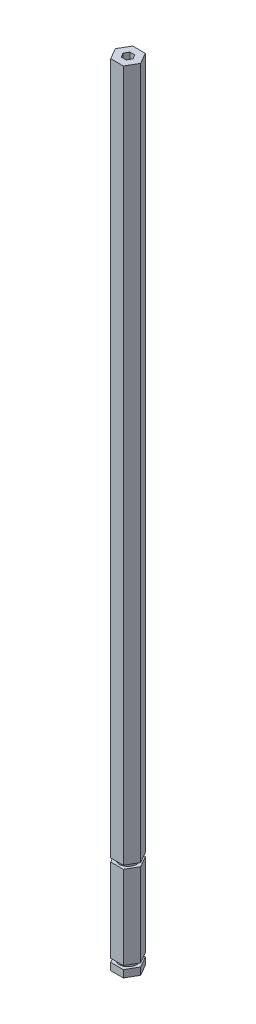
ISO-10303-21;
HEADER;
FILE_DESCRIPTION(('STEP AP214'),'2;1');
FILE_NAME('part.step','',(''),(''),'','','');
FILE_SCHEMA(('AUTOMOTIVE_DESIGN { 1 0 10303 214 1 1 1 1 }'));
ENDSEC;
DATA;
#1=APPLICATION_CONTEXT('core data for automotive mechanical design processes');
#2=APPLICATION_PROTOCOL_DEFINITION('international standard','automotive_design',2000,#1);
#3=PRODUCT_CONTEXT('',#1,'mechanical');
#4=PRODUCT('Part','Part','',(#3));
#5=PRODUCT_RELATED_PRODUCT_CATEGORY('part','',(#4));
#6=PRODUCT_DEFINITION_FORMATION('','',#4);
#7=PRODUCT_DEFINITION_CONTEXT('part definition',#1,'design');
#8=PRODUCT_DEFINITION('design','',#6,#7);
#9=PRODUCT_DEFINITION_SHAPE('','',#8);
#10=(LENGTH_UNIT() NAMED_UNIT(*) SI_UNIT(.MILLI.,.METRE.));
#11=(NAMED_UNIT(*) PLANE_ANGLE_UNIT() SI_UNIT($,.RADIAN.));
#12=(NAMED_UNIT(*) SI_UNIT($,.STERADIAN.) SOLID_ANGLE_UNIT());
#13=UNCERTAINTY_MEASURE_WITH_UNIT(LENGTH_MEASURE(1.E-05),#10,'distance_accuracy_value','');
#14=(GEOMETRIC_REPRESENTATION_CONTEXT(3) GLOBAL_UNCERTAINTY_ASSIGNED_CONTEXT((#13)) GLOBAL_UNIT_ASSIGNED_CONTEXT((#10,
#11,#12)) REPRESENTATION_CONTEXT('',''));
#15=CARTESIAN_POINT('',(0.,0.,0.));
#16=DIRECTION('',(0.,0.,1.));
#17=DIRECTION('',(1.,0.,0.));
#18=AXIS2_PLACEMENT_3D('',#15,#16,#17);
#19=CARTESIAN_POINT('',(3.66617420935412,457.2,6.35));
#20=DIRECTION('',(-0.866025403784439,0.,-0.5));
#21=DIRECTION('',(-0.5,0.,0.866025403784439));
#22=AXIS2_PLACEMENT_3D('',#19,#20,#21);
#23=PLANE('',#22);
#24=DIRECTION('',(-0.5,0.,0.866025403784439));
#25=VECTOR('',#24,1.);
#26=CARTESIAN_POINT('',(3.66617420935412,56.515,6.35));
#27=LINE('',#26,#25);
#28=CARTESIAN_POINT('',(7.33234841870825,56.515,0.));
#29=VERTEX_POINT('',#28);
#30=CARTESIAN_POINT('',(3.66617420935412,56.515,6.35));
#31=VERTEX_POINT('',#30);
#32=EDGE_CURVE('E300',#29,#31,#27,.T.);
#33=ORIENTED_EDGE('',*,*,#32,.F.);
#34=DIRECTION('',(0.,-1.,0.));
#35=VECTOR('',#34,1.);
#36=CARTESIAN_POINT('',(7.33234841870825,457.2,0.));
#37=LINE('',#36,#35);
#38=CARTESIAN_POINT('',(7.33234841870825,457.2,0.));
#39=VERTEX_POINT('',#38);
#40=EDGE_CURVE('E205',#39,#29,#37,.T.);
#41=ORIENTED_EDGE('',*,*,#40,.F.);
#42=DIRECTION('',(0.5,0.,-0.866025403784438));
#43=VECTOR('',#42,1.);
#44=CARTESIAN_POINT('',(3.66617420935412,457.2,6.35));
#45=LINE('',#44,#43);
#46=CARTESIAN_POINT('',(3.66617420935412,457.2,6.35));
#47=VERTEX_POINT('',#46);
#48=EDGE_CURVE('E299',#47,#39,#45,.T.);
#49=ORIENTED_EDGE('',*,*,#48,.F.);
#50=DIRECTION('',(0.,-1.,0.));
#51=VECTOR('',#50,1.);
#52=CARTESIAN_POINT('',(3.66617420935412,457.2,6.35));
#53=LINE('',#52,#51);
#54=EDGE_CURVE('E224',#47,#31,#53,.T.);
#55=ORIENTED_EDGE('',*,*,#54,.T.);
#56=EDGE_LOOP('',(#33,#41,#49,#55));
#57=FACE_BOUND('',#56,.T.);
#58=ADVANCED_FACE('F39',(#57),#23,.F.);
#59=DIRECTION('',(0.5,0.,-0.866025403784439));
#60=VECTOR('',#59,1.);
#61=CARTESIAN_POINT('',(3.66617420935412,4.191,6.35));
#62=LINE('',#61,#60);
#63=CARTESIAN_POINT('',(3.66617420935412,4.191,6.35));
#64=VERTEX_POINT('',#63);
#65=CARTESIAN_POINT('',(7.33234841870825,4.191,0.));
#66=VERTEX_POINT('',#65);
#67=EDGE_CURVE('E199',#64,#66,#62,.T.);
#68=ORIENTED_EDGE('',*,*,#67,.F.);
#69=CARTESIAN_POINT('',(3.66617420935412,0.,6.35));
#70=VERTEX_POINT('',#69);
#71=EDGE_CURVE('E211',#64,#70,#53,.T.);
#72=ORIENTED_EDGE('',*,*,#71,.T.);
#73=DIRECTION('',(0.5,0.,-0.866025403784438));
#74=VECTOR('',#73,1.);
#75=CARTESIAN_POINT('',(3.66617420935412,0.,6.35));
#76=LINE('',#75,#74);
#77=CARTESIAN_POINT('',(7.33234841870825,0.,0.));
#78=VERTEX_POINT('',#77);
#79=EDGE_CURVE('E361',#70,#78,#76,.T.);
#80=ORIENTED_EDGE('',*,*,#79,.T.);
#81=EDGE_CURVE('E213',#66,#78,#37,.T.);
#82=ORIENTED_EDGE('',*,*,#81,.F.);
#83=EDGE_LOOP('',(#68,#72,#80,#82));
#84=FACE_BOUND('',#83,.T.);
#85=ADVANCED_FACE('F209',(#84),#23,.F.);
#86=CARTESIAN_POINT('',(7.33234841870825,457.2,0.));
#87=DIRECTION('',(-0.866025403784439,0.,0.5));
#88=DIRECTION('',(0.5,0.,0.866025403784439));
#89=AXIS2_PLACEMENT_3D('',#86,#87,#88);
#90=PLANE('',#89);
#91=DIRECTION('',(0.5,0.,0.866025403784439));
#92=VECTOR('',#91,1.);
#93=CARTESIAN_POINT('',(7.33234841870825,56.515,0.));
#94=LINE('',#93,#92);
#95=CARTESIAN_POINT('',(3.66617420935412,56.515,-6.35));
#96=VERTEX_POINT('',#95);
#97=EDGE_CURVE('E296',#96,#29,#94,.T.);
#98=ORIENTED_EDGE('',*,*,#97,.F.);
#99=DIRECTION('',(0.,-1.,0.));
#100=VECTOR('',#99,1.);
#101=CARTESIAN_POINT('',(3.66617420935412,457.2,-6.35));
#102=LINE('',#101,#100);
#103=CARTESIAN_POINT('',(3.66617420935412,457.2,-6.35));
#104=VERTEX_POINT('',#103);
#105=EDGE_CURVE('E275',#104,#96,#102,.T.);
#106=ORIENTED_EDGE('',*,*,#105,.F.);
#107=DIRECTION('',(-0.5,0.,-0.866025403784439));
#108=VECTOR('',#107,1.);
#109=CARTESIAN_POINT('',(7.33234841870825,457.2,0.));
#110=LINE('',#109,#108);
#111=EDGE_CURVE('E297',#39,#104,#110,.T.);
#112=ORIENTED_EDGE('',*,*,#111,.F.);
#113=ORIENTED_EDGE('',*,*,#40,.T.);
#114=EDGE_LOOP('',(#98,#106,#112,#113));
#115=FACE_BOUND('',#114,.T.);
#116=ADVANCED_FACE('F295',(#115),#90,.F.);
#117=DIRECTION('',(-0.5,0.,-0.866025403784439));
#118=VECTOR('',#117,1.);
#119=CARTESIAN_POINT('',(7.33234841870825,4.191,0.));
#120=LINE('',#119,#118);
#121=CARTESIAN_POINT('',(3.66617420935412,4.191,-6.35));
#122=VERTEX_POINT('',#121);
#123=EDGE_CURVE('E215',#66,#122,#120,.T.);
#124=ORIENTED_EDGE('',*,*,#123,.F.);
#125=ORIENTED_EDGE('',*,*,#81,.T.);
#126=DIRECTION('',(-0.5,0.,-0.866025403784439));
#127=VECTOR('',#126,1.);
#128=CARTESIAN_POINT('',(7.33234841870825,0.,0.));
#129=LINE('',#128,#127);
#130=CARTESIAN_POINT('',(3.66617420935412,0.,-6.35));
#131=VERTEX_POINT('',#130);
#132=EDGE_CURVE('E370',#78,#131,#129,.T.);
#133=ORIENTED_EDGE('',*,*,#132,.T.);
#134=EDGE_CURVE('E269',#122,#131,#102,.T.);
#135=ORIENTED_EDGE('',*,*,#134,.F.);
#136=EDGE_LOOP('',(#124,#125,#133,#135));
#137=FACE_BOUND('',#136,.T.);
#138=ADVANCED_FACE('F384',(#137),#90,.F.);
#139=CARTESIAN_POINT('',(3.66617420935412,457.2,-6.35));
#140=DIRECTION('',(0.,0.,1.));
#141=DIRECTION('',(1.,0.,0.));
#142=AXIS2_PLACEMENT_3D('',#139,#140,#141);
#143=PLANE('',#142);
#144=DIRECTION('',(1.,0.,0.));
#145=VECTOR('',#144,1.);
#146=CARTESIAN_POINT('',(3.66617420935412,56.515,-6.35));
#147=LINE('',#146,#145);
#148=CARTESIAN_POINT('',(-3.66617420935412,56.515,-6.35));
#149=VERTEX_POINT('',#148);
#150=EDGE_CURVE('E305',#149,#96,#147,.T.);
#151=ORIENTED_EDGE('',*,*,#150,.F.);
#152=DIRECTION('',(0.,-1.,0.));
#153=VECTOR('',#152,1.);
#154=CARTESIAN_POINT('',(-3.66617420935412,457.2,-6.35));
#155=LINE('',#154,#153);
#156=CARTESIAN_POINT('',(-3.66617420935412,457.2,-6.35));
#157=VERTEX_POINT('',#156);
#158=EDGE_CURVE('E261',#157,#149,#155,.T.);
#159=ORIENTED_EDGE('',*,*,#158,.F.);
#160=DIRECTION('',(-1.,0.,0.));
#161=VECTOR('',#160,1.);
#162=CARTESIAN_POINT('',(3.66617420935412,457.2,-6.35));
#163=LINE('',#162,#161);
#164=EDGE_CURVE('E364',#104,#157,#163,.T.);
#165=ORIENTED_EDGE('',*,*,#164,.F.);
#166=ORIENTED_EDGE('',*,*,#105,.T.);
#167=EDGE_LOOP('',(#151,#159,#165,#166));
#168=FACE_BOUND('',#167,.T.);
#169=ADVANCED_FACE('F404',(#168),#143,.F.);
#170=DIRECTION('',(-1.,0.,0.));
#171=VECTOR('',#170,1.);
#172=CARTESIAN_POINT('',(3.66617420935412,4.191,-6.35));
#173=LINE('',#172,#171);
#174=CARTESIAN_POINT('',(-3.66617420935412,4.191,-6.35));
#175=VERTEX_POINT('',#174);
#176=EDGE_CURVE('E385',#122,#175,#173,.T.);
#177=ORIENTED_EDGE('',*,*,#176,.F.);
#178=ORIENTED_EDGE('',*,*,#134,.T.);
#179=DIRECTION('',(-1.,0.,0.));
#180=VECTOR('',#179,1.);
#181=CARTESIAN_POINT('',(3.66617420935412,0.,-6.35));
#182=LINE('',#181,#180);
#183=CARTESIAN_POINT('',(-3.66617420935412,0.,-6.35));
#184=VERTEX_POINT('',#183);
#185=EDGE_CURVE('E372',#131,#184,#182,.T.);
#186=ORIENTED_EDGE('',*,*,#185,.T.);
#187=EDGE_CURVE('E255',#175,#184,#155,.T.);
#188=ORIENTED_EDGE('',*,*,#187,.F.);
#189=EDGE_LOOP('',(#177,#178,#186,#188));
#190=FACE_BOUND('',#189,.T.);
#191=ADVANCED_FACE('F449',(#190),#143,.F.);
#192=CARTESIAN_POINT('',(-3.66617420935412,457.2,-6.35));
#193=DIRECTION('',(0.866025403784438,0.,0.5));
#194=DIRECTION('',(0.5,0.,-0.866025403784439));
#195=AXIS2_PLACEMENT_3D('',#192,#193,#194);
#196=PLANE('',#195);
#197=DIRECTION('',(0.5,0.,-0.866025403784439));
#198=VECTOR('',#197,1.);
#199=CARTESIAN_POINT('',(-3.66617420935412,56.515,-6.35));
#200=LINE('',#199,#198);
#201=CARTESIAN_POINT('',(-7.33234841870825,56.515,0.));
#202=VERTEX_POINT('',#201);
#203=EDGE_CURVE('E402',#202,#149,#200,.T.);
#204=ORIENTED_EDGE('',*,*,#203,.F.);
#205=DIRECTION('',(0.,-1.,0.));
#206=VECTOR('',#205,1.);
#207=CARTESIAN_POINT('',(-7.33234841870825,457.2,0.));
#208=LINE('',#207,#206);
#209=CARTESIAN_POINT('',(-7.33234841870825,457.2,0.));
#210=VERTEX_POINT('',#209);
#211=EDGE_CURVE('E248',#210,#202,#208,.T.);
#212=ORIENTED_EDGE('',*,*,#211,.F.);
#213=DIRECTION('',(-0.5,0.,0.866025403784438));
#214=VECTOR('',#213,1.);
#215=CARTESIAN_POINT('',(-3.66617420935412,457.2,-6.35));
#216=LINE('',#215,#214);
#217=EDGE_CURVE('E366',#157,#210,#216,.T.);
#218=ORIENTED_EDGE('',*,*,#217,.F.);
#219=ORIENTED_EDGE('',*,*,#158,.T.);
#220=EDGE_LOOP('',(#204,#212,#218,#219));
#221=FACE_BOUND('',#220,.T.);
#222=ADVANCED_FACE('F405',(#221),#196,.F.);
#223=DIRECTION('',(-0.5,0.,0.866025403784439));
#224=VECTOR('',#223,1.);
#225=CARTESIAN_POINT('',(-3.66617420935412,4.191,-6.35));
#226=LINE('',#225,#224);
#227=CARTESIAN_POINT('',(-7.33234841870825,4.191,0.));
#228=VERTEX_POINT('',#227);
#229=EDGE_CURVE('E387',#175,#228,#226,.T.);
#230=ORIENTED_EDGE('',*,*,#229,.F.);
#231=ORIENTED_EDGE('',*,*,#187,.T.);
#232=DIRECTION('',(-0.5,0.,0.866025403784438));
#233=VECTOR('',#232,1.);
#234=CARTESIAN_POINT('',(-3.66617420935412,0.,-6.35));
#235=LINE('',#234,#233);
#236=CARTESIAN_POINT('',(-7.33234841870825,0.,0.));
#237=VERTEX_POINT('',#236);
#238=EDGE_CURVE('E374',#184,#237,#235,.T.);
#239=ORIENTED_EDGE('',*,*,#238,.T.);
#240=EDGE_CURVE('E242',#228,#237,#208,.T.);
#241=ORIENTED_EDGE('',*,*,#240,.F.);
#242=EDGE_LOOP('',(#230,#231,#239,#241));
#243=FACE_BOUND('',#242,.T.);
#244=ADVANCED_FACE('F443',(#243),#196,.F.);
#245=CARTESIAN_POINT('',(-7.33234841870825,457.2,0.));
#246=DIRECTION('',(0.866025403784439,0.,-0.5));
#247=DIRECTION('',(-0.5,0.,-0.866025403784439));
#248=AXIS2_PLACEMENT_3D('',#245,#246,#247);
#249=PLANE('',#248);
#250=DIRECTION('',(-0.5,0.,-0.866025403784439));
#251=VECTOR('',#250,1.);
#252=CARTESIAN_POINT('',(-7.33234841870825,56.515,0.));
#253=LINE('',#252,#251);
#254=CARTESIAN_POINT('',(-3.66617420935412,56.515,6.35));
#255=VERTEX_POINT('',#254);
#256=EDGE_CURVE('E400',#255,#202,#253,.T.);
#257=ORIENTED_EDGE('',*,*,#256,.F.);
#258=DIRECTION('',(0.,-1.,0.));
#259=VECTOR('',#258,1.);
#260=CARTESIAN_POINT('',(-3.66617420935412,457.2,6.35));
#261=LINE('',#260,#259);
#262=CARTESIAN_POINT('',(-3.66617420935412,457.2,6.35));
#263=VERTEX_POINT('',#262);
#264=EDGE_CURVE('E237',#263,#255,#261,.T.);
#265=ORIENTED_EDGE('',*,*,#264,.F.);
#266=DIRECTION('',(0.5,0.,0.866025403784439));
#267=VECTOR('',#266,1.);
#268=CARTESIAN_POINT('',(-7.33234841870825,457.2,0.));
#269=LINE('',#268,#267);
#270=EDGE_CURVE('E226',#210,#263,#269,.T.);
#271=ORIENTED_EDGE('',*,*,#270,.F.);
#272=ORIENTED_EDGE('',*,*,#211,.T.);
#273=EDGE_LOOP('',(#257,#265,#271,#272));
#274=FACE_BOUND('',#273,.T.);
#275=ADVANCED_FACE('F451',(#274),#249,.F.);
#276=DIRECTION('',(0.5,0.,0.866025403784439));
#277=VECTOR('',#276,1.);
#278=CARTESIAN_POINT('',(-7.33234841870825,4.191,0.));
#279=LINE('',#278,#277);
#280=CARTESIAN_POINT('',(-3.66617420935412,4.191,6.35));
#281=VERTEX_POINT('',#280);
#282=EDGE_CURVE('E54',#228,#281,#279,.T.);
#283=ORIENTED_EDGE('',*,*,#282,.F.);
#284=ORIENTED_EDGE('',*,*,#240,.T.);
#285=DIRECTION('',(0.5,0.,0.866025403784439));
#286=VECTOR('',#285,1.);
#287=CARTESIAN_POINT('',(-7.33234841870825,0.,0.));
#288=LINE('',#287,#286);
#289=CARTESIAN_POINT('',(-3.66617420935412,0.,6.35));
#290=VERTEX_POINT('',#289);
#291=EDGE_CURVE('E376',#237,#290,#288,.T.);
#292=ORIENTED_EDGE('',*,*,#291,.T.);
#293=EDGE_CURVE('E231',#281,#290,#261,.T.);
#294=ORIENTED_EDGE('',*,*,#293,.F.);
#295=EDGE_LOOP('',(#283,#284,#292,#294));
#296=FACE_BOUND('',#295,.T.);
#297=ADVANCED_FACE('F378',(#296),#249,.F.);
#298=CARTESIAN_POINT('',(-3.66617420935412,457.2,6.35));
#299=DIRECTION('',(0.,0.,-1.));
#300=DIRECTION('',(-1.,0.,0.));
#301=AXIS2_PLACEMENT_3D('',#298,#299,#300);
#302=PLANE('',#301);
#303=DIRECTION('',(-1.,0.,0.));
#304=VECTOR('',#303,1.);
#305=CARTESIAN_POINT('',(-3.66617420935412,56.515,6.35));
#306=LINE('',#305,#304);
#307=EDGE_CURVE('E47',#31,#255,#306,.T.);
#308=ORIENTED_EDGE('',*,*,#307,.F.);
#309=ORIENTED_EDGE('',*,*,#54,.F.);
#310=DIRECTION('',(1.,0.,0.));
#311=VECTOR('',#310,1.);
#312=CARTESIAN_POINT('',(-3.66617420935412,457.2,6.35));
#313=LINE('',#312,#311);
#314=EDGE_CURVE('E222',#263,#47,#313,.T.);
#315=ORIENTED_EDGE('',*,*,#314,.F.);
#316=ORIENTED_EDGE('',*,*,#264,.T.);
#317=EDGE_LOOP('',(#308,#309,#315,#316));
#318=FACE_BOUND('',#317,.T.);
#319=ADVANCED_FACE('F409',(#318),#302,.F.);
#320=DIRECTION('',(1.,0.,0.));
#321=VECTOR('',#320,1.);
#322=CARTESIAN_POINT('',(-3.66617420935412,4.191,6.35));
#323=LINE('',#322,#321);
#324=EDGE_CURVE('E196',#281,#64,#323,.T.);
#325=ORIENTED_EDGE('',*,*,#324,.F.);
#326=ORIENTED_EDGE('',*,*,#293,.T.);
#327=DIRECTION('',(1.,0.,0.));
#328=VECTOR('',#327,1.);
#329=CARTESIAN_POINT('',(-3.66617420935412,0.,6.35));
#330=LINE('',#329,#328);
#331=EDGE_CURVE('E219',#290,#70,#330,.T.);
#332=ORIENTED_EDGE('',*,*,#331,.T.);
#333=ORIENTED_EDGE('',*,*,#71,.F.);
#334=EDGE_LOOP('',(#325,#326,#332,#333));
#335=FACE_BOUND('',#334,.T.);
#336=ADVANCED_FACE('F217',(#335),#302,.F.);
#337=CARTESIAN_POINT('',(0.,457.2,0.));
#338=DIRECTION('',(0.,1.,0.));
#339=DIRECTION('',(0.,0.,1.));
#340=AXIS2_PLACEMENT_3D('',#337,#338,#339);
#341=PLANE('',#340);
#342=ORIENTED_EDGE('',*,*,#48,.T.);
#343=ORIENTED_EDGE('',*,*,#111,.T.);
#344=ORIENTED_EDGE('',*,*,#164,.T.);
#345=ORIENTED_EDGE('',*,*,#217,.T.);
#346=ORIENTED_EDGE('',*,*,#270,.T.);
#347=ORIENTED_EDGE('',*,*,#314,.T.);
#348=EDGE_LOOP('',(#342,#343,#344,#345,#346,#347));
#349=FACE_BOUND('',#348,.T.);
#350=DIRECTION('',(-1.,0.,0.));
#351=VECTOR('',#350,1.);
#352=CARTESIAN_POINT('',(1.44337567297407,457.2,-2.5));
#353=LINE('',#352,#351);
#354=CARTESIAN_POINT('',(1.44337567297407,457.2,-2.5));
#355=VERTEX_POINT('',#354);
#356=CARTESIAN_POINT('',(-1.44337567297406,457.2,-2.5));
#357=VERTEX_POINT('',#356);
#358=EDGE_CURVE('E319',#355,#357,#353,.T.);
#359=ORIENTED_EDGE('',*,*,#358,.F.);
#360=DIRECTION('',(-0.5,0.,-0.866025403784438));
#361=VECTOR('',#360,1.);
#362=CARTESIAN_POINT('',(2.88675134594813,457.2,0.));
#363=LINE('',#362,#361);
#364=CARTESIAN_POINT('',(2.88675134594813,457.2,0.));
#365=VERTEX_POINT('',#364);
#366=EDGE_CURVE('E317',#365,#355,#363,.T.);
#367=ORIENTED_EDGE('',*,*,#366,.F.);
#368=DIRECTION('',(0.5,0.,-0.866025403784438));
#369=VECTOR('',#368,1.);
#370=CARTESIAN_POINT('',(1.44337567297406,457.2,2.5));
#371=LINE('',#370,#369);
#372=CARTESIAN_POINT('',(1.44337567297406,457.2,2.5));
#373=VERTEX_POINT('',#372);
#374=EDGE_CURVE('E329',#373,#365,#371,.T.);
#375=ORIENTED_EDGE('',*,*,#374,.F.);
#376=DIRECTION('',(1.,0.,0.));
#377=VECTOR('',#376,1.);
#378=CARTESIAN_POINT('',(-1.44337567297406,457.2,2.5));
#379=LINE('',#378,#377);
#380=CARTESIAN_POINT('',(-1.44337567297406,457.2,2.5));
#381=VERTEX_POINT('',#380);
#382=EDGE_CURVE('E326',#381,#373,#379,.T.);
#383=ORIENTED_EDGE('',*,*,#382,.F.);
#384=DIRECTION('',(0.5,0.,0.866025403784439));
#385=VECTOR('',#384,1.);
#386=CARTESIAN_POINT('',(-2.88675134594813,457.2,0.));
#387=LINE('',#386,#385);
#388=CARTESIAN_POINT('',(-2.88675134594813,457.2,0.));
#389=VERTEX_POINT('',#388);
#390=EDGE_CURVE('E324',#389,#381,#387,.T.);
#391=ORIENTED_EDGE('',*,*,#390,.F.);
#392=DIRECTION('',(-0.5,0.,0.866025403784439));
#393=VECTOR('',#392,1.);
#394=CARTESIAN_POINT('',(-1.44337567297406,457.2,-2.5));
#395=LINE('',#394,#393);
#396=EDGE_CURVE('E322',#357,#389,#395,.T.);
#397=ORIENTED_EDGE('',*,*,#396,.F.);
#398=EDGE_LOOP('',(#359,#367,#375,#383,#391,#397));
#399=FACE_BOUND('',#398,.T.);
#400=ADVANCED_FACE('F407',(#349,#399),#341,.T.);
#401=CARTESIAN_POINT('',(0.,0.,0.));
#402=DIRECTION('',(0.,1.,0.));
#403=DIRECTION('',(0.,0.,1.));
#404=AXIS2_PLACEMENT_3D('',#401,#402,#403);
#405=PLANE('',#404);
#406=ORIENTED_EDGE('',*,*,#79,.F.);
#407=ORIENTED_EDGE('',*,*,#331,.F.);
#408=ORIENTED_EDGE('',*,*,#291,.F.);
#409=ORIENTED_EDGE('',*,*,#238,.F.);
#410=ORIENTED_EDGE('',*,*,#185,.F.);
#411=ORIENTED_EDGE('',*,*,#132,.F.);
#412=EDGE_LOOP('',(#406,#407,#408,#409,#410,#411));
#413=FACE_BOUND('',#412,.T.);
#414=DIRECTION('',(-0.5,0.,-0.866025403784438));
#415=VECTOR('',#414,1.);
#416=CARTESIAN_POINT('',(2.88675134594813,0.,0.));
#417=LINE('',#416,#415);
#418=CARTESIAN_POINT('',(2.88675134594813,0.,0.));
#419=VERTEX_POINT('',#418);
#420=CARTESIAN_POINT('',(1.44337567297407,0.,-2.5));
#421=VERTEX_POINT('',#420);
#422=EDGE_CURVE('E316',#419,#421,#417,.T.);
#423=ORIENTED_EDGE('',*,*,#422,.T.);
#424=DIRECTION('',(-1.,0.,0.));
#425=VECTOR('',#424,1.);
#426=CARTESIAN_POINT('',(1.44337567297407,0.,-2.5));
#427=LINE('',#426,#425);
#428=CARTESIAN_POINT('',(-1.44337567297406,0.,-2.5));
#429=VERTEX_POINT('',#428);
#430=EDGE_CURVE('E334',#421,#429,#427,.T.);
#431=ORIENTED_EDGE('',*,*,#430,.T.);
#432=DIRECTION('',(-0.5,0.,0.866025403784439));
#433=VECTOR('',#432,1.);
#434=CARTESIAN_POINT('',(-1.44337567297406,0.,-2.5));
#435=LINE('',#434,#433);
#436=CARTESIAN_POINT('',(-2.88675134594813,0.,0.));
#437=VERTEX_POINT('',#436);
#438=EDGE_CURVE('E337',#429,#437,#435,.T.);
#439=ORIENTED_EDGE('',*,*,#438,.T.);
#440=DIRECTION('',(0.5,0.,0.866025403784439));
#441=VECTOR('',#440,1.);
#442=CARTESIAN_POINT('',(-2.88675134594813,0.,0.));
#443=LINE('',#442,#441);
#444=CARTESIAN_POINT('',(-1.44337567297406,0.,2.5));
#445=VERTEX_POINT('',#444);
#446=EDGE_CURVE('E340',#437,#445,#443,.T.);
#447=ORIENTED_EDGE('',*,*,#446,.T.);
#448=DIRECTION('',(1.,0.,0.));
#449=VECTOR('',#448,1.);
#450=CARTESIAN_POINT('',(-1.44337567297406,0.,2.5));
#451=LINE('',#450,#449);
#452=CARTESIAN_POINT('',(1.44337567297406,0.,2.5));
#453=VERTEX_POINT('',#452);
#454=EDGE_CURVE('E343',#445,#453,#451,.T.);
#455=ORIENTED_EDGE('',*,*,#454,.T.);
#456=DIRECTION('',(0.5,0.,-0.866025403784438));
#457=VECTOR('',#456,1.);
#458=CARTESIAN_POINT('',(1.44337567297406,0.,2.5));
#459=LINE('',#458,#457);
#460=EDGE_CURVE('E320',#453,#419,#459,.T.);
#461=ORIENTED_EDGE('',*,*,#460,.T.);
#462=EDGE_LOOP('',(#423,#431,#439,#447,#455,#461));
#463=FACE_BOUND('',#462,.T.);
#464=ADVANCED_FACE('F381',(#413,#463),#405,.F.);
#465=CARTESIAN_POINT('',(2.88675134594813,457.2,0.));
#466=DIRECTION('',(-0.866025403784438,0.,0.5));
#467=DIRECTION('',(0.5,0.,0.866025403784439));
#468=AXIS2_PLACEMENT_3D('',#465,#466,#467);
#469=PLANE('',#468);
#470=ORIENTED_EDGE('',*,*,#422,.F.);
#471=DIRECTION('',(0.,-1.,0.));
#472=VECTOR('',#471,1.);
#473=CARTESIAN_POINT('',(2.88675134594813,457.2,0.));
#474=LINE('',#473,#472);
#475=EDGE_CURVE('E331',#365,#419,#474,.T.);
#476=ORIENTED_EDGE('',*,*,#475,.F.);
#477=ORIENTED_EDGE('',*,*,#366,.T.);
#478=DIRECTION('',(0.,-1.,0.));
#479=VECTOR('',#478,1.);
#480=CARTESIAN_POINT('',(1.44337567297407,457.2,-2.5));
#481=LINE('',#480,#479);
#482=EDGE_CURVE('E358',#355,#421,#481,.T.);
#483=ORIENTED_EDGE('',*,*,#482,.T.);
#484=EDGE_LOOP('',(#470,#476,#477,#483));
#485=FACE_BOUND('',#484,.T.);
#486=ADVANCED_FACE('F531',(#485),#469,.T.);
#487=CARTESIAN_POINT('',(1.44337567297407,457.2,-2.5));
#488=DIRECTION('',(0.,0.,1.));
#489=DIRECTION('',(1.,0.,0.));
#490=AXIS2_PLACEMENT_3D('',#487,#488,#489);
#491=PLANE('',#490);
#492=ORIENTED_EDGE('',*,*,#430,.F.);
#493=ORIENTED_EDGE('',*,*,#482,.F.);
#494=ORIENTED_EDGE('',*,*,#358,.T.);
#495=DIRECTION('',(0.,-1.,0.));
#496=VECTOR('',#495,1.);
#497=CARTESIAN_POINT('',(-1.44337567297406,457.2,-2.5));
#498=LINE('',#497,#496);
#499=EDGE_CURVE('E356',#357,#429,#498,.T.);
#500=ORIENTED_EDGE('',*,*,#499,.T.);
#501=EDGE_LOOP('',(#492,#493,#494,#500));
#502=FACE_BOUND('',#501,.T.);
#503=ADVANCED_FACE('F527',(#502),#491,.T.);
#504=CARTESIAN_POINT('',(-1.44337567297406,457.2,-2.5));
#505=DIRECTION('',(0.866025403784439,0.,0.5));
#506=DIRECTION('',(0.5,0.,-0.866025403784439));
#507=AXIS2_PLACEMENT_3D('',#504,#505,#506);
#508=PLANE('',#507);
#509=ORIENTED_EDGE('',*,*,#438,.F.);
#510=ORIENTED_EDGE('',*,*,#499,.F.);
#511=ORIENTED_EDGE('',*,*,#396,.T.);
#512=DIRECTION('',(0.,-1.,0.));
#513=VECTOR('',#512,1.);
#514=CARTESIAN_POINT('',(-2.88675134594813,457.2,0.));
#515=LINE('',#514,#513);
#516=EDGE_CURVE('E354',#389,#437,#515,.T.);
#517=ORIENTED_EDGE('',*,*,#516,.T.);
#518=EDGE_LOOP('',(#509,#510,#511,#517));
#519=FACE_BOUND('',#518,.T.);
#520=ADVANCED_FACE('F523',(#519),#508,.T.);
#521=CARTESIAN_POINT('',(-2.88675134594813,457.2,0.));
#522=DIRECTION('',(0.866025403784439,0.,-0.5));
#523=DIRECTION('',(-0.5,0.,-0.866025403784439));
#524=AXIS2_PLACEMENT_3D('',#521,#522,#523);
#525=PLANE('',#524);
#526=ORIENTED_EDGE('',*,*,#446,.F.);
#527=ORIENTED_EDGE('',*,*,#516,.F.);
#528=ORIENTED_EDGE('',*,*,#390,.T.);
#529=DIRECTION('',(0.,-1.,0.));
#530=VECTOR('',#529,1.);
#531=CARTESIAN_POINT('',(-1.44337567297406,457.2,2.5));
#532=LINE('',#531,#530);
#533=EDGE_CURVE('E352',#381,#445,#532,.T.);
#534=ORIENTED_EDGE('',*,*,#533,.T.);
#535=EDGE_LOOP('',(#526,#527,#528,#534));
#536=FACE_BOUND('',#535,.T.);
#537=ADVANCED_FACE('F519',(#536),#525,.T.);
#538=CARTESIAN_POINT('',(-1.44337567297406,457.2,2.5));
#539=DIRECTION('',(0.,0.,-1.));
#540=DIRECTION('',(-1.,0.,0.));
#541=AXIS2_PLACEMENT_3D('',#538,#539,#540);
#542=PLANE('',#541);
#543=ORIENTED_EDGE('',*,*,#454,.F.);
#544=ORIENTED_EDGE('',*,*,#533,.F.);
#545=ORIENTED_EDGE('',*,*,#382,.T.);
#546=DIRECTION('',(0.,-1.,0.));
#547=VECTOR('',#546,1.);
#548=CARTESIAN_POINT('',(1.44337567297406,457.2,2.5));
#549=LINE('',#548,#547);
#550=EDGE_CURVE('E350',#373,#453,#549,.T.);
#551=ORIENTED_EDGE('',*,*,#550,.T.);
#552=EDGE_LOOP('',(#543,#544,#545,#551));
#553=FACE_BOUND('',#552,.T.);
#554=ADVANCED_FACE('F515',(#553),#542,.T.);
#555=CARTESIAN_POINT('',(1.44337567297406,457.2,2.5));
#556=DIRECTION('',(-0.866025403784438,0.,-0.5));
#557=DIRECTION('',(-0.5,0.,0.866025403784439));
#558=AXIS2_PLACEMENT_3D('',#555,#556,#557);
#559=PLANE('',#558);
#560=ORIENTED_EDGE('',*,*,#460,.F.);
#561=ORIENTED_EDGE('',*,*,#550,.F.);
#562=ORIENTED_EDGE('',*,*,#374,.T.);
#563=ORIENTED_EDGE('',*,*,#475,.T.);
#564=EDGE_LOOP('',(#560,#561,#562,#563));
#565=FACE_BOUND('',#564,.T.);
#566=ADVANCED_FACE('F512',(#565),#559,.T.);
#567=CARTESIAN_POINT('',(0.,6.223,-5.01650000000002));
#568=DIRECTION('',(0.,-1.,0.));
#569=DIRECTION('',(0.,0.,-1.));
#570=AXIS2_PLACEMENT_3D('',#567,#568,#569);
#571=PLANE('',#570);
#572=CARTESIAN_POINT('',(0.,6.22299999999998,0.));
#573=DIRECTION('',(0.,1.,0.));
#574=DIRECTION('',(0.,0.,1.));
#575=AXIS2_PLACEMENT_3D('',#572,#573,#574);
#576=CIRCLE('',#575,5.01650000000002);
#577=CARTESIAN_POINT('',(0.,6.22299999999998,5.01650000000003));
#578=VERTEX_POINT('',#577);
#579=EDGE_CURVE('E481',#578,#578,#576,.T.);
#580=ORIENTED_EDGE('',*,*,#579,.T.);
#581=EDGE_LOOP('',(#580));
#582=FACE_BOUND('',#581,.T.);
#583=DIRECTION('',(-0.5,0.,0.866025403784439));
#584=VECTOR('',#583,1.);
#585=CARTESIAN_POINT('',(3.66617420935412,6.22299999999998,6.35));
#586=LINE('',#585,#584);
#587=CARTESIAN_POINT('',(7.33234841870825,6.22299999999998,0.));
#588=VERTEX_POINT('',#587);
#589=CARTESIAN_POINT('',(3.66617420935412,6.22299999999998,6.35));
#590=VERTEX_POINT('',#589);
#591=EDGE_CURVE('E398',#588,#590,#586,.T.);
#592=ORIENTED_EDGE('',*,*,#591,.T.);
#593=DIRECTION('',(-1.,0.,0.));
#594=VECTOR('',#593,1.);
#595=CARTESIAN_POINT('',(-3.66617420935412,6.22299999999998,6.35));
#596=LINE('',#595,#594);
#597=CARTESIAN_POINT('',(-3.66617420935412,6.22299999999998,6.35));
#598=VERTEX_POINT('',#597);
#599=EDGE_CURVE('E204',#590,#598,#596,.T.);
#600=ORIENTED_EDGE('',*,*,#599,.T.);
#601=DIRECTION('',(-0.5,0.,-0.866025403784439));
#602=VECTOR('',#601,1.);
#603=CARTESIAN_POINT('',(-7.33234841870825,6.22299999999998,0.));
#604=LINE('',#603,#602);
#605=CARTESIAN_POINT('',(-7.33234841870825,6.22299999999998,0.));
#606=VERTEX_POINT('',#605);
#607=EDGE_CURVE('E214',#598,#606,#604,.T.);
#608=ORIENTED_EDGE('',*,*,#607,.T.);
#609=DIRECTION('',(0.5,0.,-0.866025403784439));
#610=VECTOR('',#609,1.);
#611=CARTESIAN_POINT('',(-3.66617420935412,6.22299999999998,-6.35));
#612=LINE('',#611,#610);
#613=CARTESIAN_POINT('',(-3.66617420935412,6.22299999999998,-6.35));
#614=VERTEX_POINT('',#613);
#615=EDGE_CURVE('E392',#606,#614,#612,.T.);
#616=ORIENTED_EDGE('',*,*,#615,.T.);
#617=DIRECTION('',(1.,0.,0.));
#618=VECTOR('',#617,1.);
#619=CARTESIAN_POINT('',(3.66617420935412,6.22299999999998,-6.35));
#620=LINE('',#619,#618);
#621=CARTESIAN_POINT('',(3.66617420935412,6.22299999999998,-6.35));
#622=VERTEX_POINT('',#621);
#623=EDGE_CURVE('E394',#614,#622,#620,.T.);
#624=ORIENTED_EDGE('',*,*,#623,.T.);
#625=DIRECTION('',(0.5,0.,0.866025403784439));
#626=VECTOR('',#625,1.);
#627=CARTESIAN_POINT('',(7.33234841870825,6.22299999999998,0.));
#628=LINE('',#627,#626);
#629=EDGE_CURVE('E396',#622,#588,#628,.T.);
#630=ORIENTED_EDGE('',*,*,#629,.T.);
#631=EDGE_LOOP('',(#592,#600,#608,#616,#624,#630));
#632=FACE_BOUND('',#631,.T.);
#633=ADVANCED_FACE('F414',(#582,#632),#571,.T.);
#634=CARTESIAN_POINT('',(0.,4.191,-5.01650000000002));
#635=DIRECTION('',(0.,1.,0.));
#636=DIRECTION('',(0.,0.,1.));
#637=AXIS2_PLACEMENT_3D('',#634,#635,#636);
#638=PLANE('',#637);
#639=CARTESIAN_POINT('',(0.,4.191,0.));
#640=DIRECTION('',(0.,1.,0.));
#641=DIRECTION('',(0.,0.,1.));
#642=AXIS2_PLACEMENT_3D('',#639,#640,#641);
#643=CIRCLE('',#642,5.01650000000003);
#644=CARTESIAN_POINT('',(0.,4.191,5.01650000000003));
#645=VERTEX_POINT('',#644);
#646=EDGE_CURVE('E485',#645,#645,#643,.T.);
#647=ORIENTED_EDGE('',*,*,#646,.F.);
#648=EDGE_LOOP('',(#647));
#649=FACE_BOUND('',#648,.T.);
#650=ORIENTED_EDGE('',*,*,#67,.T.);
#651=ORIENTED_EDGE('',*,*,#123,.T.);
#652=ORIENTED_EDGE('',*,*,#176,.T.);
#653=ORIENTED_EDGE('',*,*,#229,.T.);
#654=ORIENTED_EDGE('',*,*,#282,.T.);
#655=ORIENTED_EDGE('',*,*,#324,.T.);
#656=EDGE_LOOP('',(#650,#651,#652,#653,#654,#655));
#657=FACE_BOUND('',#656,.T.);
#658=ADVANCED_FACE('F198',(#649,#657),#638,.T.);
#659=CARTESIAN_POINT('',(0.,457.2,0.));
#660=DIRECTION('',(0.,1.,0.));
#661=DIRECTION('',(0.,0.,1.));
#662=AXIS2_PLACEMENT_3D('',#659,#660,#661);
#663=CYLINDRICAL_SURFACE('',#662,5.01650000000002);
#664=ORIENTED_EDGE('',*,*,#646,.T.);
#665=EDGE_LOOP('',(#664));
#666=FACE_BOUND('',#665,.T.);
#667=ORIENTED_EDGE('',*,*,#579,.F.);
#668=EDGE_LOOP('',(#667));
#669=FACE_BOUND('',#668,.T.);
#670=ADVANCED_FACE('F505',(#666,#669),#663,.T.);
#671=DIRECTION('',(1.,0.,0.));
#672=VECTOR('',#671,1.);
#673=CARTESIAN_POINT('',(-3.66617420935412,54.483,6.35));
#674=LINE('',#673,#672);
#675=CARTESIAN_POINT('',(-3.66617420935412,54.483,6.35));
#676=VERTEX_POINT('',#675);
#677=CARTESIAN_POINT('',(3.66617420935412,54.483,6.35));
#678=VERTEX_POINT('',#677);
#679=EDGE_CURVE('E11',#676,#678,#674,.T.);
#680=ORIENTED_EDGE('',*,*,#679,.F.);
#681=EDGE_CURVE('E236',#676,#598,#261,.T.);
#682=ORIENTED_EDGE('',*,*,#681,.T.);
#683=ORIENTED_EDGE('',*,*,#599,.F.);
#684=EDGE_CURVE('E221',#678,#590,#53,.T.);
#685=ORIENTED_EDGE('',*,*,#684,.F.);
#686=EDGE_LOOP('',(#680,#682,#683,#685));
#687=FACE_BOUND('',#686,.T.);
#688=ADVANCED_FACE('F423',(#687),#302,.F.);
#689=DIRECTION('',(0.5,0.,0.866025403784439));
#690=VECTOR('',#689,1.);
#691=CARTESIAN_POINT('',(-7.33234841870825,54.483,0.));
#692=LINE('',#691,#690);
#693=CARTESIAN_POINT('',(-7.33234841870825,54.483,0.));
#694=VERTEX_POINT('',#693);
#695=EDGE_CURVE('E61',#694,#676,#692,.T.);
#696=ORIENTED_EDGE('',*,*,#695,.F.);
#697=EDGE_CURVE('E247',#694,#606,#208,.T.);
#698=ORIENTED_EDGE('',*,*,#697,.T.);
#699=ORIENTED_EDGE('',*,*,#607,.F.);
#700=ORIENTED_EDGE('',*,*,#681,.F.);
#701=EDGE_LOOP('',(#696,#698,#699,#700));
#702=FACE_BOUND('',#701,.T.);
#703=ADVANCED_FACE('F421',(#702),#249,.F.);
#704=DIRECTION('',(-0.5,0.,0.866025403784439));
#705=VECTOR('',#704,1.);
#706=CARTESIAN_POINT('',(-3.66617420935412,54.483,-6.35));
#707=LINE('',#706,#705);
#708=CARTESIAN_POINT('',(-3.66617420935412,54.483,-6.35));
#709=VERTEX_POINT('',#708);
#710=EDGE_CURVE('E303',#709,#694,#707,.T.);
#711=ORIENTED_EDGE('',*,*,#710,.F.);
#712=EDGE_CURVE('E260',#709,#614,#155,.T.);
#713=ORIENTED_EDGE('',*,*,#712,.T.);
#714=ORIENTED_EDGE('',*,*,#615,.F.);
#715=ORIENTED_EDGE('',*,*,#697,.F.);
#716=EDGE_LOOP('',(#711,#713,#714,#715));
#717=FACE_BOUND('',#716,.T.);
#718=ADVANCED_FACE('F440',(#717),#196,.F.);
#719=DIRECTION('',(-1.,0.,0.));
#720=VECTOR('',#719,1.);
#721=CARTESIAN_POINT('',(3.66617420935412,54.483,-6.35));
#722=LINE('',#721,#720);
#723=CARTESIAN_POINT('',(3.66617420935412,54.483,-6.35));
#724=VERTEX_POINT('',#723);
#725=EDGE_CURVE('E310',#724,#709,#722,.T.);
#726=ORIENTED_EDGE('',*,*,#725,.F.);
#727=EDGE_CURVE('E274',#724,#622,#102,.T.);
#728=ORIENTED_EDGE('',*,*,#727,.T.);
#729=ORIENTED_EDGE('',*,*,#623,.F.);
#730=ORIENTED_EDGE('',*,*,#712,.F.);
#731=EDGE_LOOP('',(#726,#728,#729,#730));
#732=FACE_BOUND('',#731,.T.);
#733=ADVANCED_FACE('F437',(#732),#143,.F.);
#734=DIRECTION('',(-0.5,0.,-0.866025403784439));
#735=VECTOR('',#734,1.);
#736=CARTESIAN_POINT('',(7.33234841870825,54.483,0.));
#737=LINE('',#736,#735);
#738=CARTESIAN_POINT('',(7.33234841870825,54.483,0.));
#739=VERTEX_POINT('',#738);
#740=EDGE_CURVE('E312',#739,#724,#737,.T.);
#741=ORIENTED_EDGE('',*,*,#740,.F.);
#742=EDGE_CURVE('E287',#739,#588,#37,.T.);
#743=ORIENTED_EDGE('',*,*,#742,.T.);
#744=ORIENTED_EDGE('',*,*,#629,.F.);
#745=ORIENTED_EDGE('',*,*,#727,.F.);
#746=EDGE_LOOP('',(#741,#743,#744,#745));
#747=FACE_BOUND('',#746,.T.);
#748=ADVANCED_FACE('F431',(#747),#90,.F.);
#749=DIRECTION('',(0.5,0.,-0.866025403784439));
#750=VECTOR('',#749,1.);
#751=CARTESIAN_POINT('',(3.66617420935412,54.483,6.35));
#752=LINE('',#751,#750);
#753=EDGE_CURVE('E314',#678,#739,#752,.T.);
#754=ORIENTED_EDGE('',*,*,#753,.F.);
#755=ORIENTED_EDGE('',*,*,#684,.T.);
#756=ORIENTED_EDGE('',*,*,#591,.F.);
#757=ORIENTED_EDGE('',*,*,#742,.F.);
#758=EDGE_LOOP('',(#754,#755,#756,#757));
#759=FACE_BOUND('',#758,.T.);
#760=ADVANCED_FACE('F41',(#759),#23,.F.);
#761=CARTESIAN_POINT('',(0.,54.483,-5.01650000000002));
#762=DIRECTION('',(0.,1.,0.));
#763=DIRECTION('',(0.,0.,1.));
#764=AXIS2_PLACEMENT_3D('',#761,#762,#763);
#765=PLANE('',#764);
#766=CARTESIAN_POINT('',(0.,54.483,0.));
#767=DIRECTION('',(0.,1.,0.));
#768=DIRECTION('',(0.,0.,1.));
#769=AXIS2_PLACEMENT_3D('',#766,#767,#768);
#770=CIRCLE('',#769,5.01650000000002);
#771=CARTESIAN_POINT('',(0.,54.483,5.01650000000002));
#772=VERTEX_POINT('',#771);
#773=EDGE_CURVE('E478',#772,#772,#770,.T.);
#774=ORIENTED_EDGE('',*,*,#773,.F.);
#775=EDGE_LOOP('',(#774));
#776=FACE_BOUND('',#775,.T.);
#777=ORIENTED_EDGE('',*,*,#753,.T.);
#778=ORIENTED_EDGE('',*,*,#740,.T.);
#779=ORIENTED_EDGE('',*,*,#725,.T.);
#780=ORIENTED_EDGE('',*,*,#710,.T.);
#781=ORIENTED_EDGE('',*,*,#695,.T.);
#782=ORIENTED_EDGE('',*,*,#679,.T.);
#783=EDGE_LOOP('',(#777,#778,#779,#780,#781,#782));
#784=FACE_BOUND('',#783,.T.);
#785=ADVANCED_FACE('F425',(#776,#784),#765,.T.);
#786=CARTESIAN_POINT('',(0.,56.515,-5.01650000000001));
#787=DIRECTION('',(0.,-1.,0.));
#788=DIRECTION('',(0.,0.,-1.));
#789=AXIS2_PLACEMENT_3D('',#786,#787,#788);
#790=PLANE('',#789);
#791=CARTESIAN_POINT('',(0.,56.515,0.));
#792=DIRECTION('',(0.,1.,0.));
#793=DIRECTION('',(0.,0.,1.));
#794=AXIS2_PLACEMENT_3D('',#791,#792,#793);
#795=CIRCLE('',#794,5.01650000000001);
#796=CARTESIAN_POINT('',(0.,56.515,5.01650000000001));
#797=VERTEX_POINT('',#796);
#798=EDGE_CURVE('E484',#797,#797,#795,.T.);
#799=ORIENTED_EDGE('',*,*,#798,.T.);
#800=EDGE_LOOP('',(#799));
#801=FACE_BOUND('',#800,.T.);
#802=ORIENTED_EDGE('',*,*,#32,.T.);
#803=ORIENTED_EDGE('',*,*,#307,.T.);
#804=ORIENTED_EDGE('',*,*,#256,.T.);
#805=ORIENTED_EDGE('',*,*,#203,.T.);
#806=ORIENTED_EDGE('',*,*,#150,.T.);
#807=ORIENTED_EDGE('',*,*,#97,.T.);
#808=EDGE_LOOP('',(#802,#803,#804,#805,#806,#807));
#809=FACE_BOUND('',#808,.T.);
#810=ADVANCED_FACE('F403',(#801,#809),#790,.T.);
#811=CARTESIAN_POINT('',(0.,457.2,0.));
#812=DIRECTION('',(0.,1.,0.));
#813=DIRECTION('',(0.,0.,1.));
#814=AXIS2_PLACEMENT_3D('',#811,#812,#813);
#815=CYLINDRICAL_SURFACE('',#814,5.01650000000001);
#816=ORIENTED_EDGE('',*,*,#773,.T.);
#817=EDGE_LOOP('',(#816));
#818=FACE_BOUND('',#817,.T.);
#819=ORIENTED_EDGE('',*,*,#798,.F.);
#820=EDGE_LOOP('',(#819));
#821=FACE_BOUND('',#820,.T.);
#822=ADVANCED_FACE('F494',(#818,#821),#815,.T.);
#823=CLOSED_SHELL('',(#58,#85,#116,#138,#169,#191,#222,#244,#275,#297,#319,#336,#400,#464,#486,
#503,#520,#537,#554,#566,#633,#658,#670,#688,#703,#718,#733,#748,#760,#785,#810,#822));
#824=MANIFOLD_SOLID_BREP('B2',#823);
#825=ADVANCED_BREP_SHAPE_REPRESENTATION('',(#18,#824),#14);
#826=SHAPE_DEFINITION_REPRESENTATION(#9,#825);
ENDSEC;
END-ISO-10303-21;
